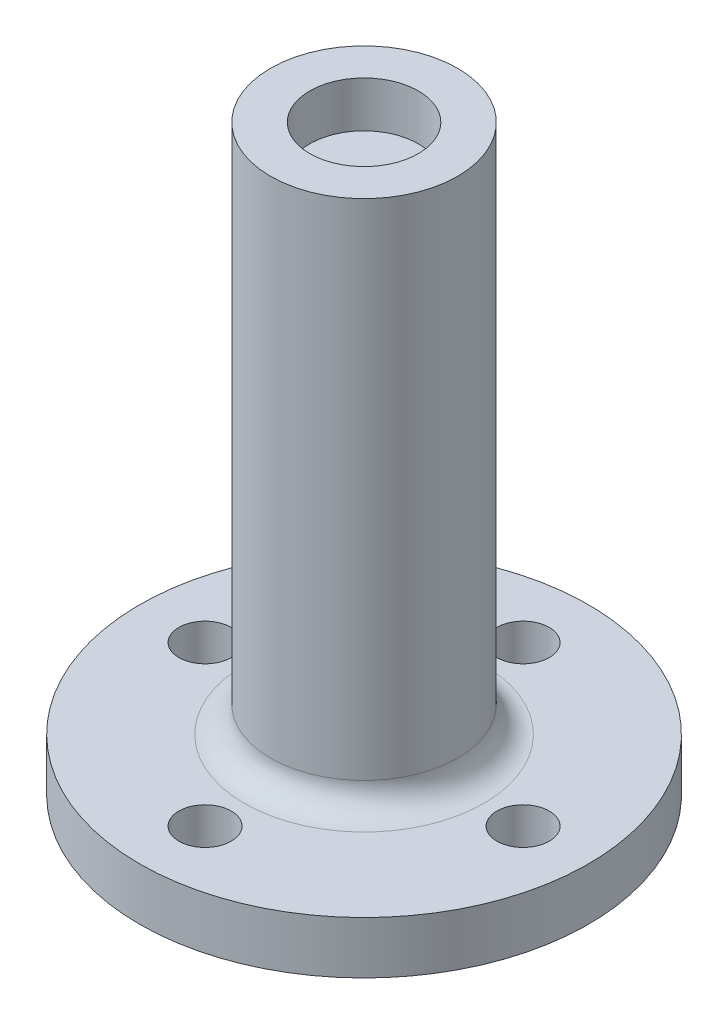
ISO-10303-21;
HEADER;
FILE_DESCRIPTION(('STEP AP214'),'2;1');
FILE_NAME('part.step','',(''),(''),'','','');
FILE_SCHEMA(('AUTOMOTIVE_DESIGN { 1 0 10303 214 1 1 1 1 }'));
ENDSEC;
DATA;
#1=APPLICATION_CONTEXT('core data for automotive mechanical design processes');
#2=APPLICATION_PROTOCOL_DEFINITION('international standard','automotive_design',2000,#1);
#3=PRODUCT_CONTEXT('',#1,'mechanical');
#4=PRODUCT('Part','Part','',(#3));
#5=PRODUCT_RELATED_PRODUCT_CATEGORY('part','',(#4));
#6=PRODUCT_DEFINITION_FORMATION('','',#4);
#7=PRODUCT_DEFINITION_CONTEXT('part definition',#1,'design');
#8=PRODUCT_DEFINITION('design','',#6,#7);
#9=PRODUCT_DEFINITION_SHAPE('','',#8);
#10=(LENGTH_UNIT() NAMED_UNIT(*) SI_UNIT(.MILLI.,.METRE.));
#11=(NAMED_UNIT(*) PLANE_ANGLE_UNIT() SI_UNIT($,.RADIAN.));
#12=(NAMED_UNIT(*) SI_UNIT($,.STERADIAN.) SOLID_ANGLE_UNIT());
#13=UNCERTAINTY_MEASURE_WITH_UNIT(LENGTH_MEASURE(1.E-05),#10,'distance_accuracy_value','');
#14=(GEOMETRIC_REPRESENTATION_CONTEXT(3) GLOBAL_UNCERTAINTY_ASSIGNED_CONTEXT((#13)) GLOBAL_UNIT_ASSIGNED_CONTEXT((#10,
#11,#12)) REPRESENTATION_CONTEXT('',''));
#15=CARTESIAN_POINT('',(0.,0.,0.));
#16=DIRECTION('',(0.,0.,1.));
#17=DIRECTION('',(1.,0.,0.));
#18=AXIS2_PLACEMENT_3D('',#15,#16,#17);
#19=CARTESIAN_POINT('',(0.,0.,0.));
#20=DIRECTION('',(0.,1.,0.));
#21=DIRECTION('',(0.,0.,1.));
#22=AXIS2_PLACEMENT_3D('',#19,#20,#21);
#23=CYLINDRICAL_SURFACE('',#22,7.15);
#24=CARTESIAN_POINT('',(0.,-35.,0.));
#25=DIRECTION('',(0.,1.,0.));
#26=DIRECTION('',(0.,0.,1.));
#27=AXIS2_PLACEMENT_3D('',#24,#25,#26);
#28=CIRCLE('',#27,7.15);
#29=CARTESIAN_POINT('',(0.,-35.,7.15));
#30=VERTEX_POINT('',#29);
#31=EDGE_CURVE('E10',#30,#30,#28,.T.);
#32=ORIENTED_EDGE('',*,*,#31,.T.);
#33=EDGE_LOOP('',(#32));
#34=FACE_BOUND('',#33,.T.);
#35=CARTESIAN_POINT('',(0.,3.5,0.));
#36=DIRECTION('',(0.,1.,0.));
#37=DIRECTION('',(0.,0.,1.));
#38=AXIS2_PLACEMENT_3D('',#35,#36,#37);
#39=CIRCLE('',#38,7.15);
#40=CARTESIAN_POINT('',(0.,3.5,7.15));
#41=VERTEX_POINT('',#40);
#42=EDGE_CURVE('E56',#41,#41,#39,.T.);
#43=ORIENTED_EDGE('',*,*,#42,.F.);
#44=EDGE_LOOP('',(#43));
#45=FACE_BOUND('',#44,.T.);
#46=ADVANCED_FACE('F31',(#34,#45),#23,.T.);
#47=CARTESIAN_POINT('',(0.,-35.,0.));
#48=DIRECTION('',(0.,1.,0.));
#49=DIRECTION('',(0.,0.,1.));
#50=AXIS2_PLACEMENT_3D('',#47,#48,#49);
#51=TOROIDAL_SURFACE('',#50,9.15,2.);
#52=CARTESIAN_POINT('',(0.,-37.,0.));
#53=DIRECTION('',(0.,1.,0.));
#54=DIRECTION('',(0.,0.,1.));
#55=AXIS2_PLACEMENT_3D('',#52,#53,#54);
#56=CIRCLE('',#55,9.15);
#57=CARTESIAN_POINT('',(0.,-37.,9.15));
#58=VERTEX_POINT('',#57);
#59=EDGE_CURVE('E37',#58,#58,#56,.T.);
#60=ORIENTED_EDGE('',*,*,#59,.T.);
#61=EDGE_LOOP('',(#60));
#62=FACE_BOUND('',#61,.T.);
#63=ORIENTED_EDGE('',*,*,#31,.F.);
#64=EDGE_LOOP('',(#63));
#65=FACE_BOUND('',#64,.T.);
#66=ADVANCED_FACE('F91',(#62,#65),#51,.F.);
#67=CARTESIAN_POINT('',(0.,-37.,17.15));
#68=DIRECTION('',(0.,1.,0.));
#69=DIRECTION('',(0.,0.,1.));
#70=AXIS2_PLACEMENT_3D('',#67,#68,#69);
#71=PLANE('',#70);
#72=CARTESIAN_POINT('',(0.,-37.,-12.15));
#73=DIRECTION('',(0.,1.,0.));
#74=DIRECTION('',(0.,0.,1.));
#75=AXIS2_PLACEMENT_3D('',#72,#73,#74);
#76=CIRCLE('',#75,2.);
#77=CARTESIAN_POINT('',(0.,-37.,-10.15));
#78=VERTEX_POINT('',#77);
#79=EDGE_CURVE('E76',#78,#78,#76,.T.);
#80=ORIENTED_EDGE('',*,*,#79,.F.);
#81=EDGE_LOOP('',(#80));
#82=FACE_BOUND('',#81,.T.);
#83=CARTESIAN_POINT('',(12.15,-37.,0.));
#84=DIRECTION('',(0.,1.,0.));
#85=DIRECTION('',(0.,0.,1.));
#86=AXIS2_PLACEMENT_3D('',#83,#84,#85);
#87=CIRCLE('',#86,2.);
#88=CARTESIAN_POINT('',(12.15,-37.,2.00000000000004));
#89=VERTEX_POINT('',#88);
#90=EDGE_CURVE('E70',#89,#89,#87,.T.);
#91=ORIENTED_EDGE('',*,*,#90,.F.);
#92=EDGE_LOOP('',(#91));
#93=FACE_BOUND('',#92,.T.);
#94=CARTESIAN_POINT('',(3.42470342537395E-13,-37.,12.15));
#95=DIRECTION('',(0.,1.,0.));
#96=DIRECTION('',(0.,0.,1.));
#97=AXIS2_PLACEMENT_3D('',#94,#95,#96);
#98=CIRCLE('',#97,2.00000000000041);
#99=CARTESIAN_POINT('',(3.42470342537395E-13,-37.,14.1500000000004));
#100=VERTEX_POINT('',#99);
#101=EDGE_CURVE('E63',#100,#100,#98,.T.);
#102=ORIENTED_EDGE('',*,*,#101,.F.);
#103=EDGE_LOOP('',(#102));
#104=FACE_BOUND('',#103,.T.);
#105=CARTESIAN_POINT('',(-12.15,-37.,-1.32682119504489E-13));
#106=DIRECTION('',(0.,1.,0.));
#107=DIRECTION('',(0.,0.,1.));
#108=AXIS2_PLACEMENT_3D('',#105,#106,#107);
#109=CIRCLE('',#108,2.);
#110=CARTESIAN_POINT('',(-12.15,-37.,1.99999999999987));
#111=VERTEX_POINT('',#110);
#112=EDGE_CURVE('E64',#111,#111,#109,.T.);
#113=ORIENTED_EDGE('',*,*,#112,.F.);
#114=EDGE_LOOP('',(#113));
#115=FACE_BOUND('',#114,.T.);
#116=CARTESIAN_POINT('',(0.,-37.,0.));
#117=DIRECTION('',(0.,1.,0.));
#118=DIRECTION('',(0.,0.,1.));
#119=AXIS2_PLACEMENT_3D('',#116,#117,#118);
#120=CIRCLE('',#119,17.15);
#121=CARTESIAN_POINT('',(0.,-37.,17.15));
#122=VERTEX_POINT('',#121);
#123=EDGE_CURVE('E41',#122,#122,#120,.T.);
#124=ORIENTED_EDGE('',*,*,#123,.T.);
#125=EDGE_LOOP('',(#124));
#126=FACE_BOUND('',#125,.T.);
#127=ORIENTED_EDGE('',*,*,#59,.F.);
#128=EDGE_LOOP('',(#127));
#129=FACE_BOUND('',#128,.T.);
#130=ADVANCED_FACE('F87',(#82,#93,#104,#115,#126,#129),#71,.T.);
#131=CARTESIAN_POINT('',(0.,0.,0.));
#132=DIRECTION('',(0.,1.,0.));
#133=DIRECTION('',(0.,0.,1.));
#134=AXIS2_PLACEMENT_3D('',#131,#132,#133);
#135=CYLINDRICAL_SURFACE('',#134,17.15);
#136=CARTESIAN_POINT('',(0.,-41.,0.));
#137=DIRECTION('',(0.,1.,0.));
#138=DIRECTION('',(0.,0.,1.));
#139=AXIS2_PLACEMENT_3D('',#136,#137,#138);
#140=CIRCLE('',#139,17.15);
#141=CARTESIAN_POINT('',(0.,-41.,17.15));
#142=VERTEX_POINT('',#141);
#143=EDGE_CURVE('E45',#142,#142,#140,.T.);
#144=ORIENTED_EDGE('',*,*,#143,.T.);
#145=EDGE_LOOP('',(#144));
#146=FACE_BOUND('',#145,.T.);
#147=ORIENTED_EDGE('',*,*,#123,.F.);
#148=EDGE_LOOP('',(#147));
#149=FACE_BOUND('',#148,.T.);
#150=ADVANCED_FACE('F90',(#146,#149),#135,.T.);
#151=CARTESIAN_POINT('',(0.,-41.,0.));
#152=DIRECTION('',(0.,-1.,0.));
#153=DIRECTION('',(0.,0.,-1.));
#154=AXIS2_PLACEMENT_3D('',#151,#152,#153);
#155=PLANE('',#154);
#156=CARTESIAN_POINT('',(0.,-41.,-12.15));
#157=DIRECTION('',(0.,-1.,0.));
#158=DIRECTION('',(0.,0.,-1.));
#159=AXIS2_PLACEMENT_3D('',#156,#157,#158);
#160=CIRCLE('',#159,2.);
#161=CARTESIAN_POINT('',(0.,-41.,-14.15));
#162=VERTEX_POINT('',#161);
#163=EDGE_CURVE('E59',#162,#162,#160,.F.);
#164=ORIENTED_EDGE('',*,*,#163,.T.);
#165=EDGE_LOOP('',(#164));
#166=FACE_BOUND('',#165,.T.);
#167=CARTESIAN_POINT('',(12.15,-41.,0.));
#168=DIRECTION('',(0.,-1.,0.));
#169=DIRECTION('',(0.,0.,-1.));
#170=AXIS2_PLACEMENT_3D('',#167,#168,#169);
#171=CIRCLE('',#170,2.);
#172=CARTESIAN_POINT('',(12.15,-41.,-1.99999999999996));
#173=VERTEX_POINT('',#172);
#174=EDGE_CURVE('E73',#173,#173,#171,.F.);
#175=ORIENTED_EDGE('',*,*,#174,.T.);
#176=EDGE_LOOP('',(#175));
#177=FACE_BOUND('',#176,.T.);
#178=CARTESIAN_POINT('',(3.42470342537395E-13,-41.,12.15));
#179=DIRECTION('',(0.,-1.,0.));
#180=DIRECTION('',(0.,0.,-1.));
#181=AXIS2_PLACEMENT_3D('',#178,#179,#180);
#182=CIRCLE('',#181,2.00000000000041);
#183=CARTESIAN_POINT('',(3.42470342537395E-13,-41.,10.1499999999996));
#184=VERTEX_POINT('',#183);
#185=EDGE_CURVE('E67',#184,#184,#182,.F.);
#186=ORIENTED_EDGE('',*,*,#185,.T.);
#187=EDGE_LOOP('',(#186));
#188=FACE_BOUND('',#187,.T.);
#189=CARTESIAN_POINT('',(-12.15,-41.,-1.33122790678376E-13));
#190=DIRECTION('',(0.,-1.,0.));
#191=DIRECTION('',(0.,0.,-1.));
#192=AXIS2_PLACEMENT_3D('',#189,#190,#191);
#193=CIRCLE('',#192,2.);
#194=CARTESIAN_POINT('',(-12.15,-41.,-2.00000000000013));
#195=VERTEX_POINT('',#194);
#196=EDGE_CURVE('E60',#195,#195,#193,.F.);
#197=ORIENTED_EDGE('',*,*,#196,.T.);
#198=EDGE_LOOP('',(#197));
#199=FACE_BOUND('',#198,.T.);
#200=ORIENTED_EDGE('',*,*,#143,.F.);
#201=EDGE_LOOP('',(#200));
#202=FACE_BOUND('',#201,.T.);
#203=ADVANCED_FACE('F103',(#166,#177,#188,#199,#202),#155,.T.);
#204=CARTESIAN_POINT('',(0.,0.,4.15));
#205=DIRECTION('',(0.,1.,0.));
#206=DIRECTION('',(0.,0.,1.));
#207=AXIS2_PLACEMENT_3D('',#204,#205,#206);
#208=PLANE('',#207);
#209=CARTESIAN_POINT('',(0.,0.,0.));
#210=DIRECTION('',(0.,1.,0.));
#211=DIRECTION('',(0.,0.,1.));
#212=AXIS2_PLACEMENT_3D('',#209,#210,#211);
#213=CIRCLE('',#212,4.15);
#214=CARTESIAN_POINT('',(0.,0.,4.15));
#215=VERTEX_POINT('',#214);
#216=EDGE_CURVE('E50',#215,#215,#213,.T.);
#217=ORIENTED_EDGE('',*,*,#216,.T.);
#218=EDGE_LOOP('',(#217));
#219=FACE_BOUND('',#218,.T.);
#220=ADVANCED_FACE('F109',(#219),#208,.T.);
#221=CARTESIAN_POINT('',(0.,0.,0.));
#222=DIRECTION('',(0.,1.,0.));
#223=DIRECTION('',(0.,0.,1.));
#224=AXIS2_PLACEMENT_3D('',#221,#222,#223);
#225=CYLINDRICAL_SURFACE('',#224,4.15);
#226=CARTESIAN_POINT('',(0.,3.5,0.));
#227=DIRECTION('',(0.,1.,0.));
#228=DIRECTION('',(0.,0.,1.));
#229=AXIS2_PLACEMENT_3D('',#226,#227,#228);
#230=CIRCLE('',#229,4.15);
#231=CARTESIAN_POINT('',(0.,3.5,4.15));
#232=VERTEX_POINT('',#231);
#233=EDGE_CURVE('E53',#232,#232,#230,.T.);
#234=ORIENTED_EDGE('',*,*,#233,.T.);
#235=EDGE_LOOP('',(#234));
#236=FACE_BOUND('',#235,.T.);
#237=ORIENTED_EDGE('',*,*,#216,.F.);
#238=EDGE_LOOP('',(#237));
#239=FACE_BOUND('',#238,.T.);
#240=ADVANCED_FACE('F123',(#236,#239),#225,.F.);
#241=CARTESIAN_POINT('',(0.,3.5,7.15));
#242=DIRECTION('',(0.,1.,0.));
#243=DIRECTION('',(0.,0.,1.));
#244=AXIS2_PLACEMENT_3D('',#241,#242,#243);
#245=PLANE('',#244);
#246=ORIENTED_EDGE('',*,*,#42,.T.);
#247=EDGE_LOOP('',(#246));
#248=FACE_BOUND('',#247,.T.);
#249=ORIENTED_EDGE('',*,*,#233,.F.);
#250=EDGE_LOOP('',(#249));
#251=FACE_BOUND('',#250,.T.);
#252=ADVANCED_FACE('F119',(#248,#251),#245,.T.);
#253=CARTESIAN_POINT('',(-12.15,-46.6568542494935,-1.33745993829035E-13));
#254=DIRECTION('',(0.,1.,0.));
#255=DIRECTION('',(0.,0.,1.));
#256=AXIS2_PLACEMENT_3D('',#253,#254,#255);
#257=CYLINDRICAL_SURFACE('',#256,2.);
#258=ORIENTED_EDGE('',*,*,#112,.T.);
#259=EDGE_LOOP('',(#258));
#260=FACE_BOUND('',#259,.T.);
#261=ORIENTED_EDGE('',*,*,#196,.F.);
#262=EDGE_LOOP('',(#261));
#263=FACE_BOUND('',#262,.T.);
#264=ADVANCED_FACE('F122',(#260,#263),#257,.F.);
#265=CARTESIAN_POINT('',(3.42470342537395E-13,-46.6568542494935,12.15));
#266=DIRECTION('',(0.,1.,0.));
#267=DIRECTION('',(0.,0.,1.));
#268=AXIS2_PLACEMENT_3D('',#265,#266,#267);
#269=CYLINDRICAL_SURFACE('',#268,2.00000000000041);
#270=ORIENTED_EDGE('',*,*,#101,.T.);
#271=EDGE_LOOP('',(#270));
#272=FACE_BOUND('',#271,.T.);
#273=ORIENTED_EDGE('',*,*,#185,.F.);
#274=EDGE_LOOP('',(#273));
#275=FACE_BOUND('',#274,.T.);
#276=ADVANCED_FACE('F139',(#272,#275),#269,.F.);
#277=CARTESIAN_POINT('',(12.15,-46.6568542494935,0.));
#278=DIRECTION('',(0.,1.,0.));
#279=DIRECTION('',(0.,0.,1.));
#280=AXIS2_PLACEMENT_3D('',#277,#278,#279);
#281=CYLINDRICAL_SURFACE('',#280,2.);
#282=ORIENTED_EDGE('',*,*,#90,.T.);
#283=EDGE_LOOP('',(#282));
#284=FACE_BOUND('',#283,.T.);
#285=ORIENTED_EDGE('',*,*,#174,.F.);
#286=EDGE_LOOP('',(#285));
#287=FACE_BOUND('',#286,.T.);
#288=ADVANCED_FACE('F143',(#284,#287),#281,.F.);
#289=CARTESIAN_POINT('',(0.,-46.6568542494935,-12.15));
#290=DIRECTION('',(0.,1.,0.));
#291=DIRECTION('',(0.,0.,1.));
#292=AXIS2_PLACEMENT_3D('',#289,#290,#291);
#293=CYLINDRICAL_SURFACE('',#292,2.);
#294=ORIENTED_EDGE('',*,*,#79,.T.);
#295=EDGE_LOOP('',(#294));
#296=FACE_BOUND('',#295,.T.);
#297=ORIENTED_EDGE('',*,*,#163,.F.);
#298=EDGE_LOOP('',(#297));
#299=FACE_BOUND('',#298,.T.);
#300=ADVANCED_FACE('F84',(#296,#299),#293,.F.);
#301=CLOSED_SHELL('',(#46,#66,#130,#150,#203,#220,#240,#252,#264,#276,#288,#300));
#302=MANIFOLD_SOLID_BREP('B2',#301);
#303=ADVANCED_BREP_SHAPE_REPRESENTATION('',(#18,#302),#14);
#304=SHAPE_DEFINITION_REPRESENTATION(#9,#303);
ENDSEC;
END-ISO-10303-21;
